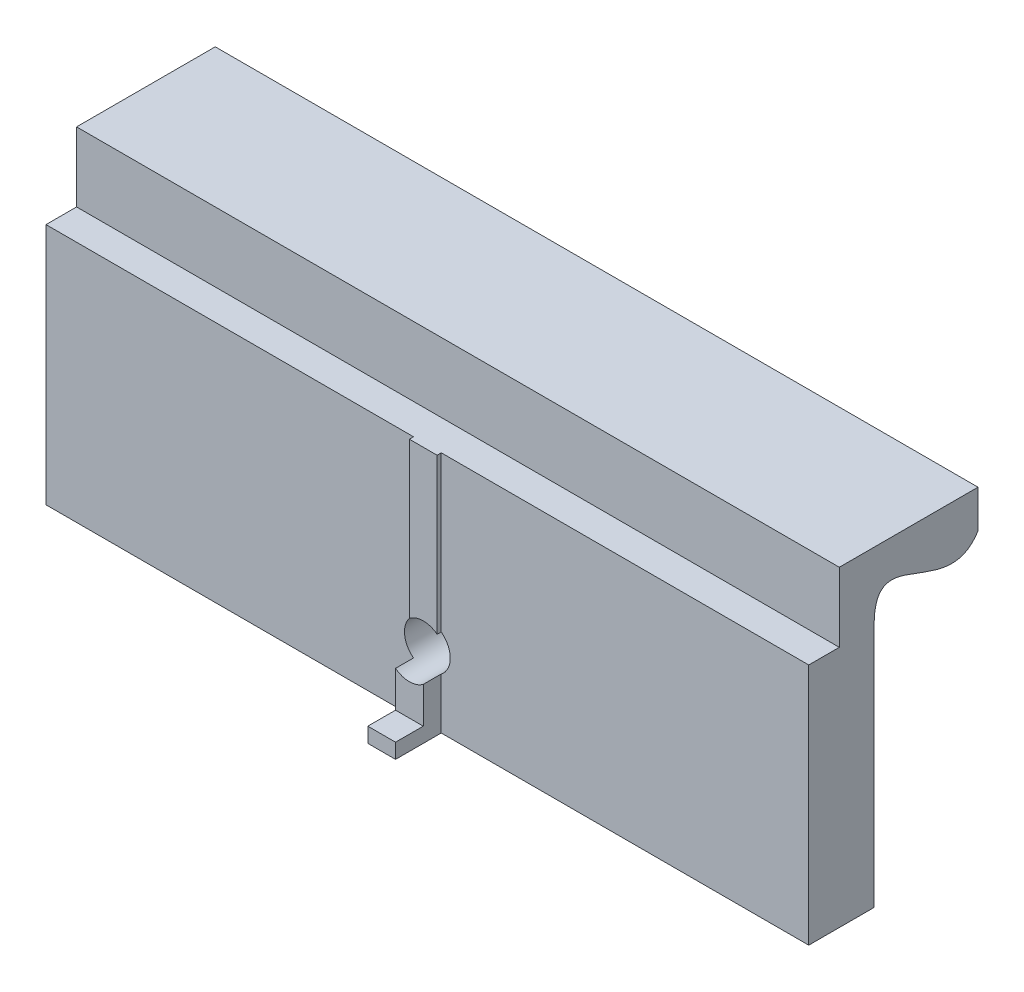
ISO-10303-21;
HEADER;
FILE_DESCRIPTION(('STEP AP214'),'2;1');
FILE_NAME('part.step','',(''),(''),'','','');
FILE_SCHEMA(('AUTOMOTIVE_DESIGN { 1 0 10303 214 1 1 1 1 }'));
ENDSEC;
DATA;
#1=APPLICATION_CONTEXT('core data for automotive mechanical design processes');
#2=APPLICATION_PROTOCOL_DEFINITION('international standard','automotive_design',2000,#1);
#3=PRODUCT_CONTEXT('',#1,'mechanical');
#4=PRODUCT('Part','Part','',(#3));
#5=PRODUCT_RELATED_PRODUCT_CATEGORY('part','',(#4));
#6=PRODUCT_DEFINITION_FORMATION('','',#4);
#7=PRODUCT_DEFINITION_CONTEXT('part definition',#1,'design');
#8=PRODUCT_DEFINITION('design','',#6,#7);
#9=PRODUCT_DEFINITION_SHAPE('','',#8);
#10=(LENGTH_UNIT() NAMED_UNIT(*) SI_UNIT(.MILLI.,.METRE.));
#11=(NAMED_UNIT(*) PLANE_ANGLE_UNIT() SI_UNIT($,.RADIAN.));
#12=(NAMED_UNIT(*) SI_UNIT($,.STERADIAN.) SOLID_ANGLE_UNIT());
#13=UNCERTAINTY_MEASURE_WITH_UNIT(LENGTH_MEASURE(1.E-05),#10,'distance_accuracy_value','');
#14=(GEOMETRIC_REPRESENTATION_CONTEXT(3) GLOBAL_UNCERTAINTY_ASSIGNED_CONTEXT((#13)) GLOBAL_UNIT_ASSIGNED_CONTEXT((#10,
#11,#12)) REPRESENTATION_CONTEXT('',''));
#15=CARTESIAN_POINT('',(0.,0.,0.));
#16=DIRECTION('',(0.,0.,1.));
#17=DIRECTION('',(1.,0.,0.));
#18=AXIS2_PLACEMENT_3D('',#15,#16,#17);
#19=CARTESIAN_POINT('',(110.,24.4205588001141,34.3831838996293));
#20=DIRECTION('',(0.,0.,-1.));
#21=DIRECTION('',(-1.,0.,0.));
#22=AXIS2_PLACEMENT_3D('',#19,#20,#21);
#23=PLANE('',#22);
#24=DIRECTION('',(-1.,0.,0.));
#25=VECTOR('',#24,1.);
#26=CARTESIAN_POINT('',(57.,-8.42684876134144,34.3831838996293));
#27=LINE('',#26,#25);
#28=CARTESIAN_POINT('',(57.,-8.42684876134144,34.3831838996293));
#29=VERTEX_POINT('',#28);
#30=CARTESIAN_POINT('',(53.,-8.42684876134144,34.3831838996293));
#31=VERTEX_POINT('',#30);
#32=EDGE_CURVE('E65',#29,#31,#27,.T.);
#33=ORIENTED_EDGE('',*,*,#32,.F.);
#34=DIRECTION('',(0.,-1.,0.));
#35=VECTOR('',#34,1.);
#36=CARTESIAN_POINT('',(57.,99.4205588001141,34.3831838996293));
#37=LINE('',#36,#35);
#38=CARTESIAN_POINT('',(57.,-3.20432214956727,34.3831838996293));
#39=VERTEX_POINT('',#38);
#40=EDGE_CURVE('E316',#39,#29,#37,.T.);
#41=ORIENTED_EDGE('',*,*,#40,.F.);
#42=CARTESIAN_POINT('',(55.,-0.57944119988594,34.3831838996293));
#43=DIRECTION('',(0.,0.,-1.));
#44=DIRECTION('',(-1.,0.,0.));
#45=AXIS2_PLACEMENT_3D('',#42,#43,#44);
#46=CIRCLE('',#45,3.3);
#47=CARTESIAN_POINT('',(53.,-3.20432214956727,34.3831838996293));
#48=VERTEX_POINT('',#47);
#49=EDGE_CURVE('E222',#39,#48,#46,.T.);
#50=ORIENTED_EDGE('',*,*,#49,.T.);
#51=DIRECTION('',(0.,-1.,0.));
#52=VECTOR('',#51,1.);
#53=CARTESIAN_POINT('',(53.,99.4205588001141,34.3831838996293));
#54=LINE('',#53,#52);
#55=EDGE_CURVE('E329',#48,#31,#54,.T.);
#56=ORIENTED_EDGE('',*,*,#55,.T.);
#57=EDGE_LOOP('',(#33,#41,#50,#56));
#58=FACE_BOUND('',#57,.T.);
#59=ADVANCED_FACE('F50',(#58),#23,.F.);
#60=CARTESIAN_POINT('',(57.,99.4205588001141,34.3831838996293));
#61=DIRECTION('',(-1.,0.,0.));
#62=DIRECTION('',(0.,0.,1.));
#63=AXIS2_PLACEMENT_3D('',#60,#61,#62);
#64=PLANE('',#63);
#65=DIRECTION('',(0.,1.,0.));
#66=VECTOR('',#65,1.);
#67=CARTESIAN_POINT('',(57.,99.4205588001141,32.3831838996293));
#68=LINE('',#67,#66);
#69=CARTESIAN_POINT('',(57.,2.0454397497954,32.3831838996293));
#70=VERTEX_POINT('',#69);
#71=CARTESIAN_POINT('',(57.,24.4077693006838,32.3831724597988));
#72=VERTEX_POINT('',#71);
#73=EDGE_CURVE('E301',#70,#72,#68,.T.);
#74=ORIENTED_EDGE('',*,*,#73,.F.);
#75=DIRECTION('',(0.,0.,-1.));
#76=VECTOR('',#75,1.);
#77=CARTESIAN_POINT('',(57.,2.0454397497954,22.3831838996293));
#78=LINE('',#77,#76);
#79=CARTESIAN_POINT('',(57.,2.0454397497954,31.7918690513678));
#80=VERTEX_POINT('',#79);
#81=EDGE_CURVE('E68',#70,#80,#78,.T.);
#82=ORIENTED_EDGE('',*,*,#81,.T.);
#83=DIRECTION('',(0.,-1.,0.));
#84=VECTOR('',#83,1.);
#85=CARTESIAN_POINT('',(57.,99.4205588001141,31.7918690513678));
#86=LINE('',#85,#84);
#87=CARTESIAN_POINT('',(57.,24.4205588001141,31.7918690513678));
#88=VERTEX_POINT('',#87);
#89=EDGE_CURVE('E321',#88,#80,#86,.T.);
#90=ORIENTED_EDGE('',*,*,#89,.F.);
#91=DIRECTION('',(0.,0.,-1.));
#92=VECTOR('',#91,1.);
#93=CARTESIAN_POINT('',(57.,24.4205588001141,27.3831838996293));
#94=LINE('',#93,#92);
#95=EDGE_CURVE('E54',#72,#88,#94,.T.);
#96=ORIENTED_EDGE('',*,*,#95,.F.);
#97=EDGE_LOOP('',(#74,#82,#90,#96));
#98=FACE_BOUND('',#97,.T.);
#99=ADVANCED_FACE('F267',(#98),#64,.F.);
#100=CARTESIAN_POINT('',(53.,99.4205588001141,31.7918690513678));
#101=DIRECTION('',(1.,0.,0.));
#102=DIRECTION('',(0.,0.,-1.));
#103=AXIS2_PLACEMENT_3D('',#100,#101,#102);
#104=PLANE('',#103);
#105=ORIENTED_EDGE('',*,*,#55,.F.);
#106=DIRECTION('',(0.,0.,-1.));
#107=VECTOR('',#106,1.);
#108=CARTESIAN_POINT('',(53.,-3.20432214956728,22.3831838996293));
#109=LINE('',#108,#107);
#110=CARTESIAN_POINT('',(53.,-3.20432214956728,31.7918690513678));
#111=VERTEX_POINT('',#110);
#112=EDGE_CURVE('E233',#48,#111,#109,.T.);
#113=ORIENTED_EDGE('',*,*,#112,.T.);
#114=DIRECTION('',(0.,-1.,0.));
#115=VECTOR('',#114,1.);
#116=CARTESIAN_POINT('',(53.,99.4205588001141,31.7918690513678));
#117=LINE('',#116,#115);
#118=CARTESIAN_POINT('',(53.,-10.5794411998859,31.7918690513678));
#119=VERTEX_POINT('',#118);
#120=EDGE_CURVE('E182',#111,#119,#117,.T.);
#121=ORIENTED_EDGE('',*,*,#120,.T.);
#122=DIRECTION('',(0.,0.,1.));
#123=VECTOR('',#122,1.);
#124=CARTESIAN_POINT('',(53.,-10.5794411998859,31.7918690513678));
#125=LINE('',#124,#123);
#126=CARTESIAN_POINT('',(53.,-10.5794411998859,38.3831838996293));
#127=VERTEX_POINT('',#126);
#128=EDGE_CURVE('E175',#119,#127,#125,.T.);
#129=ORIENTED_EDGE('',*,*,#128,.T.);
#130=DIRECTION('',(0.,-1.,0.));
#131=VECTOR('',#130,1.);
#132=CARTESIAN_POINT('',(53.,-10.5794411998859,38.3831838996293));
#133=LINE('',#132,#131);
#134=CARTESIAN_POINT('',(53.,-8.42684876134144,38.3831838996293));
#135=VERTEX_POINT('',#134);
#136=EDGE_CURVE('E180',#135,#127,#133,.T.);
#137=ORIENTED_EDGE('',*,*,#136,.F.);
#138=DIRECTION('',(0.,0.,-1.));
#139=VECTOR('',#138,1.);
#140=CARTESIAN_POINT('',(53.,-8.42684876134144,37.3831838996293));
#141=LINE('',#140,#139);
#142=EDGE_CURVE('E210',#135,#31,#141,.T.);
#143=ORIENTED_EDGE('',*,*,#142,.T.);
#144=EDGE_LOOP('',(#105,#113,#121,#129,#137,#143));
#145=FACE_BOUND('',#144,.T.);
#146=ADVANCED_FACE('F174',(#145),#104,.F.);
#147=CARTESIAN_POINT('',(110.,24.4205588001141,27.3831838996293));
#148=DIRECTION('',(0.,-1.,0.));
#149=DIRECTION('',(0.,0.,-1.));
#150=AXIS2_PLACEMENT_3D('',#147,#148,#149);
#151=PLANE('',#150);
#152=CARTESIAN_POINT('',(57.,24.4205588001141,32.3831838996293));
#153=DIRECTION('',(-1.,0.,0.));
#154=VECTOR('',#153,1.);
#155=LINE('',#152,#154);
#156=CARTESIAN_POINT('',(53.,24.4141746969835,32.3831889069406));
#157=VERTEX_POINT('',#156);
#158=EDGE_CURVE('E239',#72,#157,#155,.T.);
#159=ORIENTED_EDGE('',*,*,#158,.F.);
#160=ORIENTED_EDGE('',*,*,#95,.T.);
#161=DIRECTION('',(1.,0.,0.));
#162=VECTOR('',#161,1.);
#163=CARTESIAN_POINT('',(110.,24.4205588001141,31.7918690513678));
#164=LINE('',#163,#162);
#165=CARTESIAN_POINT('',(110.,24.4205588001141,31.7918690513678));
#166=VERTEX_POINT('',#165);
#167=EDGE_CURVE('E322',#88,#166,#164,.T.);
#168=ORIENTED_EDGE('',*,*,#167,.T.);
#169=DIRECTION('',(0.,0.,1.));
#170=VECTOR('',#169,1.);
#171=CARTESIAN_POINT('',(110.,24.4205588001141,27.3831838996293));
#172=LINE('',#171,#170);
#173=CARTESIAN_POINT('',(110.,24.4205588001141,27.3831838996293));
#174=VERTEX_POINT('',#173);
#175=EDGE_CURVE('E419',#174,#166,#172,.T.);
#176=ORIENTED_EDGE('',*,*,#175,.F.);
#177=DIRECTION('',(-1.,0.,0.));
#178=VECTOR('',#177,1.);
#179=CARTESIAN_POINT('',(110.,24.4205588001141,27.3831838996293));
#180=LINE('',#179,#178);
#181=CARTESIAN_POINT('',(0.,24.4205588001141,27.3831838996293));
#182=VERTEX_POINT('',#181);
#183=EDGE_CURVE('E399',#174,#182,#180,.T.);
#184=ORIENTED_EDGE('',*,*,#183,.T.);
#185=DIRECTION('',(0.,0.,1.));
#186=VECTOR('',#185,1.);
#187=CARTESIAN_POINT('',(0.,24.4205588001141,27.3831838996293));
#188=LINE('',#187,#186);
#189=CARTESIAN_POINT('',(0.,24.4205588001141,31.7918690513678));
#190=VERTEX_POINT('',#189);
#191=EDGE_CURVE('E390',#182,#190,#188,.T.);
#192=ORIENTED_EDGE('',*,*,#191,.T.);
#193=DIRECTION('',(1.,0.,0.));
#194=VECTOR('',#193,1.);
#195=CARTESIAN_POINT('',(110.,24.4205588001141,31.7918690513678));
#196=LINE('',#195,#194);
#197=CARTESIAN_POINT('',(53.,24.4205588001141,31.7918690513678));
#198=VERTEX_POINT('',#197);
#199=EDGE_CURVE('E335',#190,#198,#196,.T.);
#200=ORIENTED_EDGE('',*,*,#199,.T.);
#201=DIRECTION('',(0.,0.,1.));
#202=VECTOR('',#201,1.);
#203=CARTESIAN_POINT('',(53.,24.4205588001141,27.3831838996293));
#204=LINE('',#203,#202);
#205=EDGE_CURVE('E319',#198,#157,#204,.T.);
#206=ORIENTED_EDGE('',*,*,#205,.T.);
#207=EDGE_LOOP('',(#159,#160,#168,#176,#184,#192,#200,#206));
#208=FACE_BOUND('',#207,.T.);
#209=ADVANCED_FACE('F270',(#208),#151,.F.);
#210=CARTESIAN_POINT('',(57.,-3.20432214956728,31.7918690513678));
#211=VERTEX_POINT('',#210);
#212=CARTESIAN_POINT('',(57.,-10.5794411998859,31.7918690513678));
#213=VERTEX_POINT('',#212);
#214=EDGE_CURVE('E324',#211,#213,#86,.T.);
#215=ORIENTED_EDGE('',*,*,#214,.F.);
#216=DIRECTION('',(0.,0.,-1.));
#217=VECTOR('',#216,1.);
#218=CARTESIAN_POINT('',(57.,-3.20432214956728,22.3831838996293));
#219=LINE('',#218,#217);
#220=EDGE_CURVE('E237',#211,#39,#219,.F.);
#221=ORIENTED_EDGE('',*,*,#220,.T.);
#222=ORIENTED_EDGE('',*,*,#40,.T.);
#223=DIRECTION('',(0.,0.,-1.));
#224=VECTOR('',#223,1.);
#225=CARTESIAN_POINT('',(57.,-8.42684876134144,37.3831838996293));
#226=LINE('',#225,#224);
#227=CARTESIAN_POINT('',(57.,-8.42684876134144,38.3831838996293));
#228=VERTEX_POINT('',#227);
#229=EDGE_CURVE('E207',#228,#29,#226,.T.);
#230=ORIENTED_EDGE('',*,*,#229,.F.);
#231=DIRECTION('',(0.,1.,0.));
#232=VECTOR('',#231,1.);
#233=CARTESIAN_POINT('',(57.,-8.42684876134144,38.3831838996293));
#234=LINE('',#233,#232);
#235=CARTESIAN_POINT('',(57.,-10.5794411998859,38.3831838996293));
#236=VERTEX_POINT('',#235);
#237=EDGE_CURVE('E198',#236,#228,#234,.T.);
#238=ORIENTED_EDGE('',*,*,#237,.F.);
#239=DIRECTION('',(0.,0.,-1.));
#240=VECTOR('',#239,1.);
#241=CARTESIAN_POINT('',(57.,-10.5794411998859,34.3831838996293));
#242=LINE('',#241,#240);
#243=EDGE_CURVE('E191',#236,#213,#242,.T.);
#244=ORIENTED_EDGE('',*,*,#243,.T.);
#245=EDGE_LOOP('',(#215,#221,#222,#230,#238,#244));
#246=FACE_BOUND('',#245,.T.);
#247=ADVANCED_FACE('F262',(#246),#64,.F.);
#248=CARTESIAN_POINT('',(110.,-10.5794411998859,34.3831838996293));
#249=DIRECTION('',(0.,1.,0.));
#250=DIRECTION('',(0.,0.,1.));
#251=AXIS2_PLACEMENT_3D('',#248,#249,#250);
#252=PLANE('',#251);
#253=ORIENTED_EDGE('',*,*,#243,.F.);
#254=DIRECTION('',(1.,0.,0.));
#255=VECTOR('',#254,1.);
#256=CARTESIAN_POINT('',(57.,-10.5794411998859,38.3831838996293));
#257=LINE('',#256,#255);
#258=EDGE_CURVE('E186',#127,#236,#257,.T.);
#259=ORIENTED_EDGE('',*,*,#258,.F.);
#260=ORIENTED_EDGE('',*,*,#128,.F.);
#261=DIRECTION('',(1.,0.,0.));
#262=VECTOR('',#261,1.);
#263=CARTESIAN_POINT('',(0.,-10.5794411998859,31.7918690513678));
#264=LINE('',#263,#262);
#265=CARTESIAN_POINT('',(0.,-10.5794411998859,31.7918690513678));
#266=VERTEX_POINT('',#265);
#267=EDGE_CURVE('E183',#266,#119,#264,.T.);
#268=ORIENTED_EDGE('',*,*,#267,.F.);
#269=DIRECTION('',(0.,0.,-1.));
#270=VECTOR('',#269,1.);
#271=CARTESIAN_POINT('',(0.,-10.5794411998859,34.3831838996293));
#272=LINE('',#271,#270);
#273=CARTESIAN_POINT('',(0.,-10.5794411998859,22.3831838996293));
#274=VERTEX_POINT('',#273);
#275=EDGE_CURVE('E347',#266,#274,#272,.T.);
#276=ORIENTED_EDGE('',*,*,#275,.T.);
#277=DIRECTION('',(-1.,0.,0.));
#278=VECTOR('',#277,1.);
#279=CARTESIAN_POINT('',(110.,-10.5794411998859,22.3831838996293));
#280=LINE('',#279,#278);
#281=CARTESIAN_POINT('',(110.,-10.5794411998859,22.3831838996293));
#282=VERTEX_POINT('',#281);
#283=EDGE_CURVE('E391',#282,#274,#280,.T.);
#284=ORIENTED_EDGE('',*,*,#283,.F.);
#285=DIRECTION('',(0.,0.,-1.));
#286=VECTOR('',#285,1.);
#287=CARTESIAN_POINT('',(110.,-10.5794411998859,34.3831838996293));
#288=LINE('',#287,#286);
#289=CARTESIAN_POINT('',(110.,-10.5794411998859,31.7918690513678));
#290=VERTEX_POINT('',#289);
#291=EDGE_CURVE('E396',#290,#282,#288,.T.);
#292=ORIENTED_EDGE('',*,*,#291,.F.);
#293=DIRECTION('',(1.,0.,0.));
#294=VECTOR('',#293,1.);
#295=CARTESIAN_POINT('',(57.,-10.5794411998859,31.7918690513678));
#296=LINE('',#295,#294);
#297=EDGE_CURVE('E314',#213,#290,#296,.T.);
#298=ORIENTED_EDGE('',*,*,#297,.F.);
#299=EDGE_LOOP('',(#253,#259,#260,#268,#276,#284,#292,#298));
#300=FACE_BOUND('',#299,.T.);
#301=ADVANCED_FACE('F187',(#300),#252,.F.);
#302=CARTESIAN_POINT('',(110.,28.2376459705432,16.5874897784838));
#303=DIRECTION('',(1.,0.,0.));
#304=DIRECTION('',(0.,0.,-1.));
#305=AXIS2_PLACEMENT_3D('',#302,#303,#304);
#306=PLANE('',#305);
#307=ORIENTED_EDGE('',*,*,#175,.T.);
#308=DIRECTION('',(0.,-1.,0.));
#309=VECTOR('',#308,1.);
#310=CARTESIAN_POINT('',(110.,99.4205588001141,31.7918690513678));
#311=LINE('',#310,#309);
#312=EDGE_CURVE('E320',#166,#290,#311,.T.);
#313=ORIENTED_EDGE('',*,*,#312,.T.);
#314=ORIENTED_EDGE('',*,*,#291,.T.);
#315=DIRECTION('',(0.,1.,0.));
#316=VECTOR('',#315,1.);
#317=CARTESIAN_POINT('',(110.,-10.5794411998859,22.3831838996293));
#318=LINE('',#317,#316);
#319=CARTESIAN_POINT('',(110.,24.4205588001141,22.3831838996293));
#320=VERTEX_POINT('',#319);
#321=EDGE_CURVE('E341',#282,#320,#318,.T.);
#322=ORIENTED_EDGE('',*,*,#321,.T.);
#323=CARTESIAN_POINT('',(110.,24.4205588001141,22.3831838996293));
#324=CARTESIAN_POINT('',(110.,35.8120876172881,22.4415584729101));
#325=CARTESIAN_POINT('',(110.,21.692276180417,11.8696250032939));
#326=CARTESIAN_POINT('',(110.,28.9675175711162,7.38318389962927));
#327=B_SPLINE_CURVE_WITH_KNOTS('',3,(#323,#324,#325,#326),.UNSPECIFIED.,.F.,.F.,(4,4),(0.,1.),.UNSPECIFIED.);
#328=CARTESIAN_POINT('',(110.,28.9675175711162,7.38318389962927));
#329=VERTEX_POINT('',#328);
#330=EDGE_CURVE('E342',#320,#329,#327,.T.);
#331=ORIENTED_EDGE('',*,*,#330,.T.);
#332=DIRECTION('',(0.,-1.,0.));
#333=VECTOR('',#332,1.);
#334=CARTESIAN_POINT('',(110.,34.4205588001141,7.38318389962927));
#335=LINE('',#334,#333);
#336=CARTESIAN_POINT('',(110.,34.4205588001141,7.38318389962927));
#337=VERTEX_POINT('',#336);
#338=EDGE_CURVE('E353',#337,#329,#335,.T.);
#339=ORIENTED_EDGE('',*,*,#338,.F.);
#340=DIRECTION('',(0.,0.,-1.));
#341=VECTOR('',#340,1.);
#342=CARTESIAN_POINT('',(110.,34.4205588001141,27.3831838996293));
#343=LINE('',#342,#341);
#344=CARTESIAN_POINT('',(110.,34.4205588001141,27.3831838996293));
#345=VERTEX_POINT('',#344);
#346=EDGE_CURVE('E443',#345,#337,#343,.T.);
#347=ORIENTED_EDGE('',*,*,#346,.F.);
#348=DIRECTION('',(0.,1.,0.));
#349=VECTOR('',#348,1.);
#350=CARTESIAN_POINT('',(110.,24.4205588001141,27.3831838996293));
#351=LINE('',#350,#349);
#352=EDGE_CURVE('E421',#174,#345,#351,.T.);
#353=ORIENTED_EDGE('',*,*,#352,.F.);
#354=EDGE_LOOP('',(#307,#313,#314,#322,#331,#339,#347,#353));
#355=FACE_BOUND('',#354,.T.);
#356=ADVANCED_FACE('F279',(#355),#306,.T.);
#357=CARTESIAN_POINT('',(0.,28.2376459705432,16.5874897784838));
#358=DIRECTION('',(1.,0.,0.));
#359=DIRECTION('',(0.,0.,-1.));
#360=AXIS2_PLACEMENT_3D('',#357,#358,#359);
#361=PLANE('',#360);
#362=DIRECTION('',(0.,-1.,0.));
#363=VECTOR('',#362,1.);
#364=CARTESIAN_POINT('',(0.,99.4205588001141,31.7918690513678));
#365=LINE('',#364,#363);
#366=EDGE_CURVE('E338',#190,#266,#365,.T.);
#367=ORIENTED_EDGE('',*,*,#366,.F.);
#368=ORIENTED_EDGE('',*,*,#191,.F.);
#369=DIRECTION('',(0.,1.,0.));
#370=VECTOR('',#369,1.);
#371=CARTESIAN_POINT('',(0.,24.4205588001141,27.3831838996293));
#372=LINE('',#371,#370);
#373=CARTESIAN_POINT('',(0.,34.4205588001141,27.3831838996293));
#374=VERTEX_POINT('',#373);
#375=EDGE_CURVE('E379',#182,#374,#372,.T.);
#376=ORIENTED_EDGE('',*,*,#375,.T.);
#377=DIRECTION('',(0.,0.,-1.));
#378=VECTOR('',#377,1.);
#379=CARTESIAN_POINT('',(0.,34.4205588001141,27.3831838996293));
#380=LINE('',#379,#378);
#381=CARTESIAN_POINT('',(0.,34.4205588001141,7.38318389962927));
#382=VERTEX_POINT('',#381);
#383=EDGE_CURVE('E375',#374,#382,#380,.T.);
#384=ORIENTED_EDGE('',*,*,#383,.T.);
#385=DIRECTION('',(0.,-1.,0.));
#386=VECTOR('',#385,1.);
#387=CARTESIAN_POINT('',(0.,34.4205588001141,7.38318389962927));
#388=LINE('',#387,#386);
#389=CARTESIAN_POINT('',(0.,28.9675175711162,7.38318389962927));
#390=VERTEX_POINT('',#389);
#391=EDGE_CURVE('E381',#382,#390,#388,.T.);
#392=ORIENTED_EDGE('',*,*,#391,.T.);
#393=CARTESIAN_POINT('',(0.,24.4205588001141,22.3831838996293));
#394=CARTESIAN_POINT('',(0.,35.8120876172881,22.4415584729101));
#395=CARTESIAN_POINT('',(0.,21.692276180417,11.8696250032939));
#396=CARTESIAN_POINT('',(0.,28.9675175711162,7.38318389962927));
#397=B_SPLINE_CURVE_WITH_KNOTS('',3,(#393,#394,#395,#396),.UNSPECIFIED.,.F.,.F.,(4,4),(0.,1.),.UNSPECIFIED.);
#398=CARTESIAN_POINT('',(0.,24.4205588001141,22.3831838996293));
#399=VERTEX_POINT('',#398);
#400=EDGE_CURVE('E427',#399,#390,#397,.T.);
#401=ORIENTED_EDGE('',*,*,#400,.F.);
#402=DIRECTION('',(0.,1.,0.));
#403=VECTOR('',#402,1.);
#404=CARTESIAN_POINT('',(0.,-10.5794411998859,22.3831838996293));
#405=LINE('',#404,#403);
#406=EDGE_CURVE('E344',#274,#399,#405,.T.);
#407=ORIENTED_EDGE('',*,*,#406,.F.);
#408=ORIENTED_EDGE('',*,*,#275,.F.);
#409=EDGE_LOOP('',(#367,#368,#376,#384,#392,#401,#407,#408));
#410=FACE_BOUND('',#409,.T.);
#411=ADVANCED_FACE('F283',(#410),#361,.F.);
#412=CARTESIAN_POINT('',(110.,-10.5794411998859,22.3831838996293));
#413=DIRECTION('',(0.,0.,1.));
#414=DIRECTION('',(1.,0.,0.));
#415=AXIS2_PLACEMENT_3D('',#412,#413,#414);
#416=PLANE('',#415);
#417=CARTESIAN_POINT('',(55.,-0.57944119988594,22.3831838996293));
#418=DIRECTION('',(0.,0.,-1.));
#419=DIRECTION('',(-1.,0.,0.));
#420=AXIS2_PLACEMENT_3D('',#417,#418,#419);
#421=CIRCLE('',#420,7.275);
#422=CARTESIAN_POINT('',(47.725,-0.57944119988594,22.3831838996293));
#423=VERTEX_POINT('',#422);
#424=EDGE_CURVE('E215',#423,#423,#421,.T.);
#425=ORIENTED_EDGE('',*,*,#424,.F.);
#426=EDGE_LOOP('',(#425));
#427=FACE_BOUND('',#426,.T.);
#428=ORIENTED_EDGE('',*,*,#406,.T.);
#429=DIRECTION('',(-1.,0.,0.));
#430=VECTOR('',#429,1.);
#431=CARTESIAN_POINT('',(110.,24.4205588001141,22.3831838996293));
#432=LINE('',#431,#430);
#433=EDGE_CURVE('E336',#320,#399,#432,.T.);
#434=ORIENTED_EDGE('',*,*,#433,.F.);
#435=ORIENTED_EDGE('',*,*,#321,.F.);
#436=ORIENTED_EDGE('',*,*,#283,.T.);
#437=EDGE_LOOP('',(#428,#434,#435,#436));
#438=FACE_BOUND('',#437,.T.);
#439=ADVANCED_FACE('F47',(#427,#438),#416,.F.);
#440=DIRECTION('',(-1.,0.,0.));
#441=VECTOR('',#440,1.);
#442=SURFACE_OF_LINEAR_EXTRUSION('',#327,#441);
#443=ORIENTED_EDGE('',*,*,#400,.T.);
#444=DIRECTION('',(-1.,0.,0.));
#445=VECTOR('',#444,1.);
#446=CARTESIAN_POINT('',(110.,28.9675175711162,7.38318389962927));
#447=LINE('',#446,#445);
#448=EDGE_CURVE('E402',#329,#390,#447,.T.);
#449=ORIENTED_EDGE('',*,*,#448,.F.);
#450=ORIENTED_EDGE('',*,*,#330,.F.);
#451=ORIENTED_EDGE('',*,*,#433,.T.);
#452=EDGE_LOOP('',(#443,#449,#450,#451));
#453=FACE_BOUND('',#452,.T.);
#454=ADVANCED_FACE('F359',(#453),#442,.F.);
#455=CARTESIAN_POINT('',(110.,34.4205588001141,7.38318389962927));
#456=DIRECTION('',(0.,0.,-1.));
#457=DIRECTION('',(-1.,0.,0.));
#458=AXIS2_PLACEMENT_3D('',#455,#456,#457);
#459=PLANE('',#458);
#460=ORIENTED_EDGE('',*,*,#391,.F.);
#461=DIRECTION('',(-1.,0.,0.));
#462=VECTOR('',#461,1.);
#463=CARTESIAN_POINT('',(110.,34.4205588001141,7.38318389962927));
#464=LINE('',#463,#462);
#465=EDGE_CURVE('E380',#337,#382,#464,.T.);
#466=ORIENTED_EDGE('',*,*,#465,.F.);
#467=ORIENTED_EDGE('',*,*,#338,.T.);
#468=ORIENTED_EDGE('',*,*,#448,.T.);
#469=EDGE_LOOP('',(#460,#466,#467,#468));
#470=FACE_BOUND('',#469,.T.);
#471=ADVANCED_FACE('F358',(#470),#459,.T.);
#472=CARTESIAN_POINT('',(110.,34.4205588001141,27.3831838996293));
#473=DIRECTION('',(0.,1.,0.));
#474=DIRECTION('',(0.,0.,1.));
#475=AXIS2_PLACEMENT_3D('',#472,#473,#474);
#476=PLANE('',#475);
#477=ORIENTED_EDGE('',*,*,#383,.F.);
#478=DIRECTION('',(-1.,0.,0.));
#479=VECTOR('',#478,1.);
#480=CARTESIAN_POINT('',(110.,34.4205588001141,27.3831838996293));
#481=LINE('',#480,#479);
#482=EDGE_CURVE('E374',#345,#374,#481,.T.);
#483=ORIENTED_EDGE('',*,*,#482,.F.);
#484=ORIENTED_EDGE('',*,*,#346,.T.);
#485=ORIENTED_EDGE('',*,*,#465,.T.);
#486=EDGE_LOOP('',(#477,#483,#484,#485));
#487=FACE_BOUND('',#486,.T.);
#488=ADVANCED_FACE('F362',(#487),#476,.T.);
#489=CARTESIAN_POINT('',(110.,24.4205588001141,27.3831838996293));
#490=DIRECTION('',(0.,0.,1.));
#491=DIRECTION('',(1.,0.,0.));
#492=AXIS2_PLACEMENT_3D('',#489,#490,#491);
#493=PLANE('',#492);
#494=ORIENTED_EDGE('',*,*,#375,.F.);
#495=ORIENTED_EDGE('',*,*,#183,.F.);
#496=ORIENTED_EDGE('',*,*,#352,.T.);
#497=ORIENTED_EDGE('',*,*,#482,.T.);
#498=EDGE_LOOP('',(#494,#495,#496,#497));
#499=FACE_BOUND('',#498,.T.);
#500=ADVANCED_FACE('F272',(#499),#493,.T.);
#501=CARTESIAN_POINT('',(53.,2.0454397497954,31.7918690513678));
#502=VERTEX_POINT('',#501);
#503=EDGE_CURVE('E334',#198,#502,#117,.T.);
#504=ORIENTED_EDGE('',*,*,#503,.T.);
#505=DIRECTION('',(0.,0.,-1.));
#506=VECTOR('',#505,1.);
#507=CARTESIAN_POINT('',(53.,2.0454397497954,22.3831838996293));
#508=LINE('',#507,#506);
#509=CARTESIAN_POINT('',(53.,2.0454397497954,32.3831838996293));
#510=VERTEX_POINT('',#509);
#511=EDGE_CURVE('E221',#502,#510,#508,.F.);
#512=ORIENTED_EDGE('',*,*,#511,.T.);
#513=DIRECTION('',(0.,1.,0.));
#514=VECTOR('',#513,1.);
#515=CARTESIAN_POINT('',(53.,-10.5794411998859,32.3831838996293));
#516=LINE('',#515,#514);
#517=EDGE_CURVE('E306',#510,#157,#516,.T.);
#518=ORIENTED_EDGE('',*,*,#517,.T.);
#519=ORIENTED_EDGE('',*,*,#205,.F.);
#520=EDGE_LOOP('',(#504,#512,#518,#519));
#521=FACE_BOUND('',#520,.T.);
#522=ADVANCED_FACE('F269',(#521),#104,.F.);
#523=CARTESIAN_POINT('',(0.,99.4205588001141,31.7918690513678));
#524=DIRECTION('',(0.,0.,-1.));
#525=DIRECTION('',(-1.,0.,0.));
#526=AXIS2_PLACEMENT_3D('',#523,#524,#525);
#527=PLANE('',#526);
#528=ORIENTED_EDGE('',*,*,#120,.F.);
#529=CARTESIAN_POINT('',(55.,-0.57944119988594,31.7918690513678));
#530=DIRECTION('',(0.,0.,-1.));
#531=DIRECTION('',(-1.,0.,0.));
#532=AXIS2_PLACEMENT_3D('',#529,#530,#531);
#533=CIRCLE('',#532,3.3);
#534=EDGE_CURVE('E230',#111,#502,#533,.T.);
#535=ORIENTED_EDGE('',*,*,#534,.T.);
#536=ORIENTED_EDGE('',*,*,#503,.F.);
#537=ORIENTED_EDGE('',*,*,#199,.F.);
#538=ORIENTED_EDGE('',*,*,#366,.T.);
#539=ORIENTED_EDGE('',*,*,#267,.T.);
#540=EDGE_LOOP('',(#528,#535,#536,#537,#538,#539));
#541=FACE_BOUND('',#540,.T.);
#542=ADVANCED_FACE('F265',(#541),#527,.F.);
#543=CARTESIAN_POINT('',(57.,99.4205588001141,31.7918690513678));
#544=DIRECTION('',(0.,0.,-1.));
#545=DIRECTION('',(-1.,0.,0.));
#546=AXIS2_PLACEMENT_3D('',#543,#544,#545);
#547=PLANE('',#546);
#548=ORIENTED_EDGE('',*,*,#89,.T.);
#549=CARTESIAN_POINT('',(55.,-0.57944119988594,31.7918690513678));
#550=DIRECTION('',(0.,0.,-1.));
#551=DIRECTION('',(-1.,0.,0.));
#552=AXIS2_PLACEMENT_3D('',#549,#550,#551);
#553=CIRCLE('',#552,3.3);
#554=EDGE_CURVE('E234',#80,#211,#553,.T.);
#555=ORIENTED_EDGE('',*,*,#554,.T.);
#556=ORIENTED_EDGE('',*,*,#214,.T.);
#557=ORIENTED_EDGE('',*,*,#297,.T.);
#558=ORIENTED_EDGE('',*,*,#312,.F.);
#559=ORIENTED_EDGE('',*,*,#167,.F.);
#560=EDGE_LOOP('',(#548,#555,#556,#557,#558,#559));
#561=FACE_BOUND('',#560,.T.);
#562=ADVANCED_FACE('F260',(#561),#547,.F.);
#563=CARTESIAN_POINT('',(110.,-10.5794411998859,32.3831838996293));
#564=DIRECTION('',(0.,0.,1.));
#565=DIRECTION('',(1.,0.,0.));
#566=AXIS2_PLACEMENT_3D('',#563,#564,#565);
#567=PLANE('',#566);
#568=CARTESIAN_POINT('',(55.,-0.57944119988594,32.3831838996293));
#569=DIRECTION('',(0.,0.,1.));
#570=DIRECTION('',(1.,0.,0.));
#571=AXIS2_PLACEMENT_3D('',#568,#569,#570);
#572=CIRCLE('',#571,3.3);
#573=EDGE_CURVE('E11',#70,#510,#572,.T.);
#574=ORIENTED_EDGE('',*,*,#573,.F.);
#575=ORIENTED_EDGE('',*,*,#73,.T.);
#576=ORIENTED_EDGE('',*,*,#158,.T.);
#577=ORIENTED_EDGE('',*,*,#517,.F.);
#578=EDGE_LOOP('',(#574,#575,#576,#577));
#579=FACE_BOUND('',#578,.T.);
#580=ADVANCED_FACE('F249',(#579),#567,.T.);
#581=CARTESIAN_POINT('',(55.,-0.57944119988594,22.3831838996293));
#582=DIRECTION('',(0.,0.,-1.));
#583=DIRECTION('',(-1.,0.,0.));
#584=AXIS2_PLACEMENT_3D('',#581,#582,#583);
#585=CYLINDRICAL_SURFACE('',#584,3.3);
#586=CARTESIAN_POINT('',(55.,-0.57944119988594,26.5331838996293));
#587=DIRECTION('',(0.,0.,-1.));
#588=DIRECTION('',(-1.,0.,0.));
#589=AXIS2_PLACEMENT_3D('',#586,#587,#588);
#590=CIRCLE('',#589,3.30000000000001);
#591=CARTESIAN_POINT('',(51.7,-0.57944119988594,26.5331838996293));
#592=VERTEX_POINT('',#591);
#593=EDGE_CURVE('E217',#592,#592,#590,.T.);
#594=ORIENTED_EDGE('',*,*,#593,.T.);
#595=EDGE_LOOP('',(#594));
#596=FACE_BOUND('',#595,.T.);
#597=ORIENTED_EDGE('',*,*,#554,.F.);
#598=ORIENTED_EDGE('',*,*,#81,.F.);
#599=ORIENTED_EDGE('',*,*,#573,.T.);
#600=ORIENTED_EDGE('',*,*,#511,.F.);
#601=ORIENTED_EDGE('',*,*,#534,.F.);
#602=ORIENTED_EDGE('',*,*,#112,.F.);
#603=ORIENTED_EDGE('',*,*,#49,.F.);
#604=ORIENTED_EDGE('',*,*,#220,.F.);
#605=EDGE_LOOP('',(#597,#598,#599,#600,#601,#602,#603,#604));
#606=FACE_BOUND('',#605,.T.);
#607=ADVANCED_FACE('F258',(#596,#606),#585,.F.);
#608=CARTESIAN_POINT('',(58.3,-0.57944119988594,26.5331838996293));
#609=DIRECTION('',(0.,0.,1.));
#610=DIRECTION('',(1.,0.,0.));
#611=AXIS2_PLACEMENT_3D('',#608,#609,#610);
#612=PLANE('',#611);
#613=ORIENTED_EDGE('',*,*,#593,.F.);
#614=EDGE_LOOP('',(#613));
#615=FACE_BOUND('',#614,.T.);
#616=CARTESIAN_POINT('',(55.,-0.57944119988594,26.5331838996293));
#617=DIRECTION('',(0.,0.,-1.));
#618=DIRECTION('',(-1.,0.,0.));
#619=AXIS2_PLACEMENT_3D('',#616,#617,#618);
#620=CIRCLE('',#619,7.275);
#621=CARTESIAN_POINT('',(47.725,-0.57944119988594,26.5331838996293));
#622=VERTEX_POINT('',#621);
#623=EDGE_CURVE('E214',#622,#622,#620,.T.);
#624=ORIENTED_EDGE('',*,*,#623,.T.);
#625=EDGE_LOOP('',(#624));
#626=FACE_BOUND('',#625,.T.);
#627=ADVANCED_FACE('F459',(#615,#626),#612,.F.);
#628=CARTESIAN_POINT('',(55.,-0.57944119988594,22.3831838996293));
#629=DIRECTION('',(0.,0.,-1.));
#630=DIRECTION('',(-1.,0.,0.));
#631=AXIS2_PLACEMENT_3D('',#628,#629,#630);
#632=CYLINDRICAL_SURFACE('',#631,7.275);
#633=ORIENTED_EDGE('',*,*,#623,.F.);
#634=EDGE_LOOP('',(#633));
#635=FACE_BOUND('',#634,.T.);
#636=ORIENTED_EDGE('',*,*,#424,.T.);
#637=EDGE_LOOP('',(#636));
#638=FACE_BOUND('',#637,.T.);
#639=ADVANCED_FACE('F454',(#635,#638),#632,.F.);
#640=CARTESIAN_POINT('',(57.,-8.42684876134144,37.3831838996293));
#641=DIRECTION('',(0.,-1.,0.));
#642=DIRECTION('',(0.,0.,-1.));
#643=AXIS2_PLACEMENT_3D('',#640,#641,#642);
#644=PLANE('',#643);
#645=ORIENTED_EDGE('',*,*,#32,.T.);
#646=ORIENTED_EDGE('',*,*,#142,.F.);
#647=DIRECTION('',(-1.,0.,0.));
#648=VECTOR('',#647,1.);
#649=CARTESIAN_POINT('',(53.,-8.42684876134144,38.3831838996293));
#650=LINE('',#649,#648);
#651=EDGE_CURVE('E203',#228,#135,#650,.T.);
#652=ORIENTED_EDGE('',*,*,#651,.F.);
#653=ORIENTED_EDGE('',*,*,#229,.T.);
#654=EDGE_LOOP('',(#645,#646,#652,#653));
#655=FACE_BOUND('',#654,.T.);
#656=ADVANCED_FACE('F446',(#655),#644,.F.);
#657=CARTESIAN_POINT('',(0.,0.,38.3831838996293));
#658=DIRECTION('',(0.,0.,-1.));
#659=DIRECTION('',(-1.,0.,0.));
#660=AXIS2_PLACEMENT_3D('',#657,#658,#659);
#661=PLANE('',#660);
#662=ORIENTED_EDGE('',*,*,#136,.T.);
#663=ORIENTED_EDGE('',*,*,#258,.T.);
#664=ORIENTED_EDGE('',*,*,#237,.T.);
#665=ORIENTED_EDGE('',*,*,#651,.T.);
#666=EDGE_LOOP('',(#662,#663,#664,#665));
#667=FACE_BOUND('',#666,.T.);
#668=ADVANCED_FACE('F200',(#667),#661,.F.);
#669=CLOSED_SHELL('',(#59,#99,#146,#209,#247,#301,#356,#411,#439,#454,#471,#488,#500,#522,#542,
#562,#580,#607,#627,#639,#656,#668));
#670=MANIFOLD_SOLID_BREP('B2',#669);
#671=ADVANCED_BREP_SHAPE_REPRESENTATION('',(#18,#670),#14);
#672=SHAPE_DEFINITION_REPRESENTATION(#9,#671);
ENDSEC;
END-ISO-10303-21;
